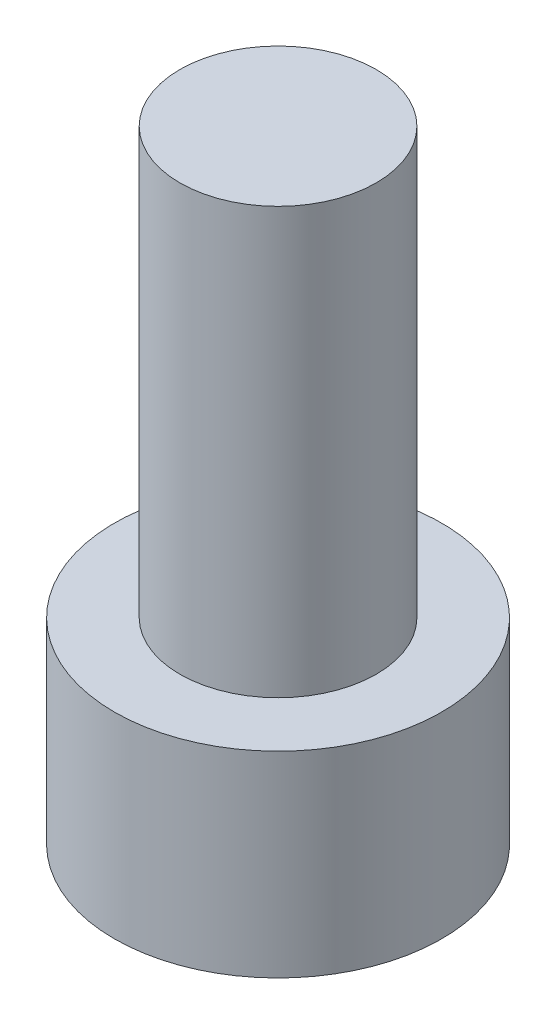
ISO-10303-21;
HEADER;
FILE_DESCRIPTION(('STEP AP214'),'2;1');
FILE_NAME('part.step','',(''),(''),'','','');
FILE_SCHEMA(('AUTOMOTIVE_DESIGN { 1 0 10303 214 1 1 1 1 }'));
ENDSEC;
DATA;
#1=APPLICATION_CONTEXT('core data for automotive mechanical design processes');
#2=APPLICATION_PROTOCOL_DEFINITION('international standard','automotive_design',2000,#1);
#3=PRODUCT_CONTEXT('',#1,'mechanical');
#4=PRODUCT('Part','Part','',(#3));
#5=PRODUCT_RELATED_PRODUCT_CATEGORY('part','',(#4));
#6=PRODUCT_DEFINITION_FORMATION('','',#4);
#7=PRODUCT_DEFINITION_CONTEXT('part definition',#1,'design');
#8=PRODUCT_DEFINITION('design','',#6,#7);
#9=PRODUCT_DEFINITION_SHAPE('','',#8);
#10=(LENGTH_UNIT() NAMED_UNIT(*) SI_UNIT(.MILLI.,.METRE.));
#11=(NAMED_UNIT(*) PLANE_ANGLE_UNIT() SI_UNIT($,.RADIAN.));
#12=(NAMED_UNIT(*) SI_UNIT($,.STERADIAN.) SOLID_ANGLE_UNIT());
#13=UNCERTAINTY_MEASURE_WITH_UNIT(LENGTH_MEASURE(1.E-05),#10,'distance_accuracy_value','');
#14=(GEOMETRIC_REPRESENTATION_CONTEXT(3) GLOBAL_UNCERTAINTY_ASSIGNED_CONTEXT((#13)) GLOBAL_UNIT_ASSIGNED_CONTEXT((#10,
#11,#12)) REPRESENTATION_CONTEXT('',''));
#15=CARTESIAN_POINT('',(0.,0.,0.));
#16=DIRECTION('',(0.,0.,1.));
#17=DIRECTION('',(1.,0.,0.));
#18=AXIS2_PLACEMENT_3D('',#15,#16,#17);
#19=CARTESIAN_POINT('',(0.,6.,0.));
#20=DIRECTION('',(0.,-1.,0.));
#21=DIRECTION('',(0.,0.,-1.));
#22=AXIS2_PLACEMENT_3D('',#19,#20,#21);
#23=CYLINDRICAL_SURFACE('',#22,5.);
#24=CARTESIAN_POINT('',(0.,6.,0.));
#25=DIRECTION('',(0.,1.,0.));
#26=DIRECTION('',(0.,0.,1.));
#27=AXIS2_PLACEMENT_3D('',#24,#25,#26);
#28=CIRCLE('',#27,5.);
#29=CARTESIAN_POINT('',(0.,6.,5.));
#30=VERTEX_POINT('',#29);
#31=EDGE_CURVE('E49',#30,#30,#28,.T.);
#32=ORIENTED_EDGE('',*,*,#31,.F.);
#33=EDGE_LOOP('',(#32));
#34=FACE_BOUND('',#33,.T.);
#35=CARTESIAN_POINT('',(0.,0.,0.));
#36=DIRECTION('',(0.,1.,0.));
#37=DIRECTION('',(0.,0.,1.));
#38=AXIS2_PLACEMENT_3D('',#35,#36,#37);
#39=CIRCLE('',#38,5.);
#40=CARTESIAN_POINT('',(0.,0.,5.));
#41=VERTEX_POINT('',#40);
#42=EDGE_CURVE('E44',#41,#41,#39,.T.);
#43=ORIENTED_EDGE('',*,*,#42,.T.);
#44=EDGE_LOOP('',(#43));
#45=FACE_BOUND('',#44,.T.);
#46=ADVANCED_FACE('F41',(#34,#45),#23,.T.);
#47=CARTESIAN_POINT('',(0.,6.,0.));
#48=DIRECTION('',(0.,1.,0.));
#49=DIRECTION('',(0.,0.,1.));
#50=AXIS2_PLACEMENT_3D('',#47,#48,#49);
#51=PLANE('',#50);
#52=CARTESIAN_POINT('',(0.,6.,0.));
#53=DIRECTION('',(0.,1.,0.));
#54=DIRECTION('',(0.,0.,1.));
#55=AXIS2_PLACEMENT_3D('',#52,#53,#54);
#56=CIRCLE('',#55,3.);
#57=CARTESIAN_POINT('',(0.,6.,-3.));
#58=VERTEX_POINT('',#57);
#59=EDGE_CURVE('E10',#58,#58,#56,.T.);
#60=ORIENTED_EDGE('',*,*,#59,.F.);
#61=EDGE_LOOP('',(#60));
#62=FACE_BOUND('',#61,.T.);
#63=ORIENTED_EDGE('',*,*,#31,.T.);
#64=EDGE_LOOP('',(#63));
#65=FACE_BOUND('',#64,.T.);
#66=ADVANCED_FACE('F69',(#62,#65),#51,.T.);
#67=CARTESIAN_POINT('',(0.,0.,0.));
#68=DIRECTION('',(0.,1.,0.));
#69=DIRECTION('',(0.,0.,1.));
#70=AXIS2_PLACEMENT_3D('',#67,#68,#69);
#71=PLANE('',#70);
#72=ORIENTED_EDGE('',*,*,#42,.F.);
#73=EDGE_LOOP('',(#72));
#74=FACE_BOUND('',#73,.T.);
#75=ADVANCED_FACE('F66',(#74),#71,.F.);
#76=CARTESIAN_POINT('',(0.,19.,0.));
#77=DIRECTION('',(0.,-1.,0.));
#78=DIRECTION('',(0.,0.,-1.));
#79=AXIS2_PLACEMENT_3D('',#76,#77,#78);
#80=CYLINDRICAL_SURFACE('',#79,3.);
#81=CARTESIAN_POINT('',(0.,19.,0.));
#82=DIRECTION('',(0.,1.,0.));
#83=DIRECTION('',(0.,0.,1.));
#84=AXIS2_PLACEMENT_3D('',#81,#82,#83);
#85=CIRCLE('',#84,3.);
#86=CARTESIAN_POINT('',(0.,19.,-3.));
#87=VERTEX_POINT('',#86);
#88=EDGE_CURVE('E56',#87,#87,#85,.T.);
#89=CARTESIAN_POINT('',(0.,19.,-3.));
#90=CARTESIAN_POINT('',(0.,18.8645833333333,-3.));
#91=CARTESIAN_POINT('',(0.,18.7291666666667,-3.));
#92=CARTESIAN_POINT('',(0.,18.4583333333333,-3.));
#93=CARTESIAN_POINT('',(0.,18.3229166666667,-3.));
#94=CARTESIAN_POINT('',(0.,18.0520833333333,-3.));
#95=CARTESIAN_POINT('',(0.,17.9166666666667,-3.));
#96=CARTESIAN_POINT('',(0.,17.6458333333333,-3.));
#97=CARTESIAN_POINT('',(0.,17.5104166666667,-3.));
#98=CARTESIAN_POINT('',(0.,17.2395833333333,-3.));
#99=CARTESIAN_POINT('',(0.,17.1041666666667,-3.));
#100=CARTESIAN_POINT('',(0.,16.8333333333333,-3.));
#101=CARTESIAN_POINT('',(0.,16.6979166666667,-3.));
#102=CARTESIAN_POINT('',(0.,16.4270833333333,-3.));
#103=CARTESIAN_POINT('',(0.,16.2916666666667,-3.));
#104=CARTESIAN_POINT('',(0.,16.0208333333333,-3.));
#105=CARTESIAN_POINT('',(0.,15.8854166666667,-3.));
#106=CARTESIAN_POINT('',(0.,15.6145833333333,-3.));
#107=CARTESIAN_POINT('',(0.,15.4791666666667,-3.));
#108=CARTESIAN_POINT('',(0.,15.2083333333333,-3.));
#109=CARTESIAN_POINT('',(0.,15.0729166666667,-3.));
#110=CARTESIAN_POINT('',(0.,14.8020833333333,-3.));
#111=CARTESIAN_POINT('',(0.,14.6666666666667,-3.));
#112=CARTESIAN_POINT('',(0.,14.3958333333333,-3.));
#113=CARTESIAN_POINT('',(0.,14.2604166666667,-3.));
#114=CARTESIAN_POINT('',(0.,13.9895833333333,-3.));
#115=CARTESIAN_POINT('',(0.,13.8541666666667,-3.));
#116=CARTESIAN_POINT('',(0.,13.5833333333333,-3.));
#117=CARTESIAN_POINT('',(0.,13.4479166666667,-3.));
#118=CARTESIAN_POINT('',(0.,13.1770833333333,-3.));
#119=CARTESIAN_POINT('',(0.,13.0416666666667,-3.));
#120=CARTESIAN_POINT('',(0.,12.7708333333333,-3.));
#121=CARTESIAN_POINT('',(0.,12.6354166666667,-3.));
#122=CARTESIAN_POINT('',(0.,12.3645833333333,-3.));
#123=CARTESIAN_POINT('',(0.,12.2291666666667,-3.));
#124=CARTESIAN_POINT('',(0.,11.9583333333333,-3.));
#125=CARTESIAN_POINT('',(0.,11.8229166666667,-3.));
#126=CARTESIAN_POINT('',(0.,11.5520833333333,-3.));
#127=CARTESIAN_POINT('',(0.,11.4166666666667,-3.));
#128=CARTESIAN_POINT('',(0.,11.1458333333333,-3.));
#129=CARTESIAN_POINT('',(0.,11.0104166666667,-3.));
#130=CARTESIAN_POINT('',(0.,10.7395833333333,-3.));
#131=CARTESIAN_POINT('',(0.,10.6041666666667,-3.));
#132=CARTESIAN_POINT('',(0.,10.3333333333333,-3.));
#133=CARTESIAN_POINT('',(0.,10.1979166666667,-3.));
#134=CARTESIAN_POINT('',(0.,9.92708333333333,-3.));
#135=CARTESIAN_POINT('',(0.,9.79166666666667,-3.));
#136=CARTESIAN_POINT('',(0.,9.52083333333333,-3.));
#137=CARTESIAN_POINT('',(0.,9.38541666666667,-3.));
#138=CARTESIAN_POINT('',(0.,9.11458333333333,-3.));
#139=CARTESIAN_POINT('',(0.,8.97916666666667,-3.));
#140=CARTESIAN_POINT('',(0.,8.70833333333333,-3.));
#141=CARTESIAN_POINT('',(0.,8.57291666666667,-3.));
#142=CARTESIAN_POINT('',(0.,8.30208333333333,-3.));
#143=CARTESIAN_POINT('',(0.,8.16666666666667,-3.));
#144=CARTESIAN_POINT('',(0.,7.89583333333333,-3.));
#145=CARTESIAN_POINT('',(0.,7.76041666666667,-3.));
#146=CARTESIAN_POINT('',(0.,7.48958333333333,-3.));
#147=CARTESIAN_POINT('',(0.,7.35416666666667,-3.));
#148=CARTESIAN_POINT('',(0.,7.08333333333333,-3.));
#149=CARTESIAN_POINT('',(0.,6.94791666666667,-3.));
#150=CARTESIAN_POINT('',(0.,6.67708333333333,-3.));
#151=CARTESIAN_POINT('',(0.,6.54166666666667,-3.));
#152=CARTESIAN_POINT('',(0.,6.27083333333333,-3.));
#153=CARTESIAN_POINT('',(0.,6.13541666666667,-3.));
#154=CARTESIAN_POINT('',(0.,6.,-3.));
#155=B_SPLINE_CURVE_WITH_KNOTS('',3,(#89,#90,#91,#92,#93,#94,#95,#96,#97,#98,#99,#100,#101,#102,
#103,#104,#105,#106,#107,#108,#109,#110,#111,#112,#113,#114,#115,#116,#117,#118,#119,#120,#121,
#122,#123,#124,#125,#126,#127,#128,#129,#130,#131,#132,#133,#134,#135,#136,#137,#138,#139,#140,
#141,#142,#143,#144,#145,#146,#147,#148,#149,#150,#151,#152,#153,#154),.UNSPECIFIED.,.F.,.F.,(4,
2,2,2,2,2,2,2,2,2,2,2,2,2,2,2,2,2,2,2,2,2,2,2,2,2,2,2,2,2,2,2,4),(0.,0.40625,0.812500000000001,
1.21875,1.625,2.03125,2.4375,2.84375,3.25,3.65625,4.0625,4.46875,4.875,5.28125,5.6875,6.09375,
6.5,6.90625,7.3125,7.71875,8.125,8.53125,8.9375,9.34375,9.75,10.15625,10.5625,10.96875,11.375,
11.78125,12.1875,12.59375,13.),.UNSPECIFIED.);
#156=EDGE_CURVE('BSEAM68',#87,#58,#155,.T.);
#157=ORIENTED_EDGE('',*,*,#88,.F.);
#158=ORIENTED_EDGE('',*,*,#59,.T.);
#159=ORIENTED_EDGE('',*,*,#156,.T.);
#160=ORIENTED_EDGE('',*,*,#156,.F.);
#161=EDGE_LOOP('',(#157,#159,#158,#160));
#162=FACE_BOUND('',#161,.T.);
#163=ADVANCED_FACE('F68',(#162),#80,.T.);
#164=CARTESIAN_POINT('',(0.,19.,0.));
#165=DIRECTION('',(0.,1.,0.));
#166=DIRECTION('',(0.,0.,1.));
#167=AXIS2_PLACEMENT_3D('',#164,#165,#166);
#168=PLANE('',#167);
#169=ORIENTED_EDGE('',*,*,#88,.T.);
#170=EDGE_LOOP('',(#169));
#171=FACE_BOUND('',#170,.T.);
#172=ADVANCED_FACE('F74',(#171),#168,.T.);
#173=CLOSED_SHELL('',(#46,#66,#75,#163,#172));
#174=MANIFOLD_SOLID_BREP('B2',#173);
#175=ADVANCED_BREP_SHAPE_REPRESENTATION('',(#18,#174),#14);
#176=SHAPE_DEFINITION_REPRESENTATION(#9,#175);
ENDSEC;
END-ISO-10303-21;
